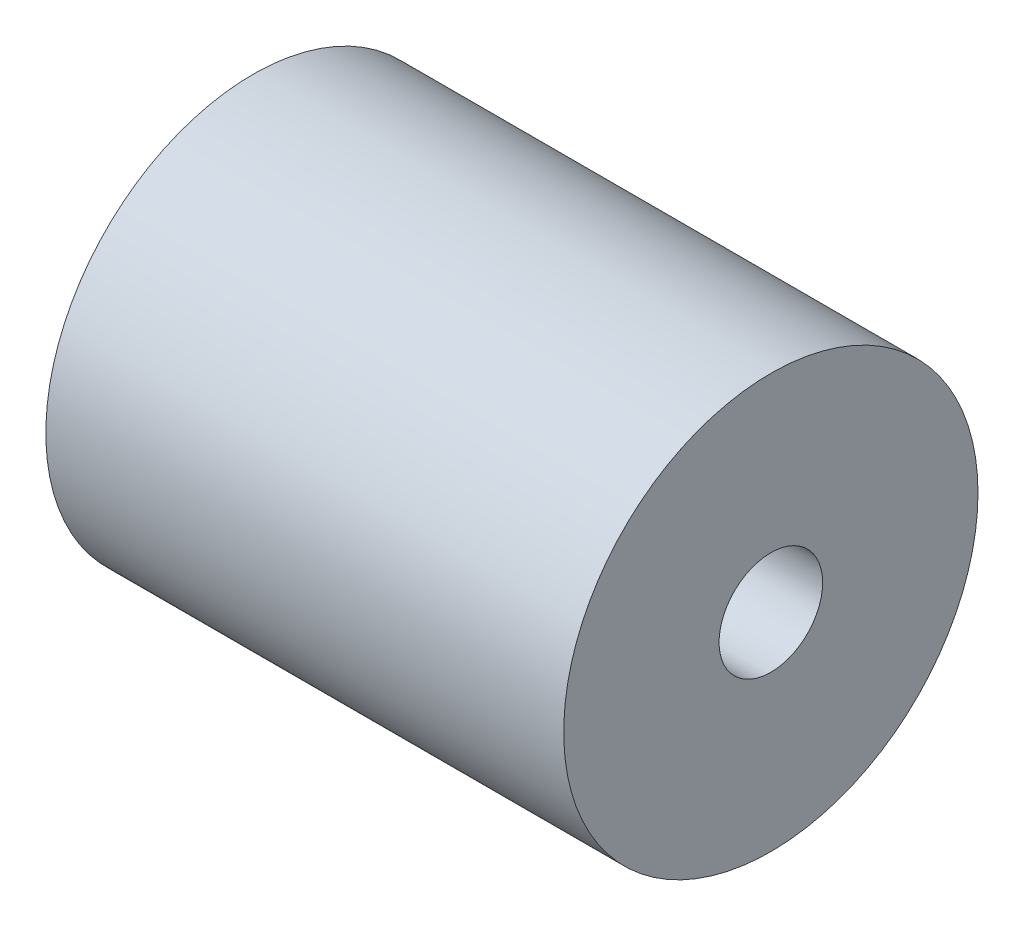
ISO-10303-21;
HEADER;
FILE_DESCRIPTION(('STEP AP214'),'2;1');
FILE_NAME('part.step','',(''),(''),'','','');
FILE_SCHEMA(('AUTOMOTIVE_DESIGN { 1 0 10303 214 1 1 1 1 }'));
ENDSEC;
DATA;
#1=APPLICATION_CONTEXT('core data for automotive mechanical design processes');
#2=APPLICATION_PROTOCOL_DEFINITION('international standard','automotive_design',2000,#1);
#3=PRODUCT_CONTEXT('',#1,'mechanical');
#4=PRODUCT('Part','Part','',(#3));
#5=PRODUCT_RELATED_PRODUCT_CATEGORY('part','',(#4));
#6=PRODUCT_DEFINITION_FORMATION('','',#4);
#7=PRODUCT_DEFINITION_CONTEXT('part definition',#1,'design');
#8=PRODUCT_DEFINITION('design','',#6,#7);
#9=PRODUCT_DEFINITION_SHAPE('','',#8);
#10=(LENGTH_UNIT() NAMED_UNIT(*) SI_UNIT(.MILLI.,.METRE.));
#11=(NAMED_UNIT(*) PLANE_ANGLE_UNIT() SI_UNIT($,.RADIAN.));
#12=(NAMED_UNIT(*) SI_UNIT($,.STERADIAN.) SOLID_ANGLE_UNIT());
#13=UNCERTAINTY_MEASURE_WITH_UNIT(LENGTH_MEASURE(1.E-05),#10,'distance_accuracy_value','');
#14=(GEOMETRIC_REPRESENTATION_CONTEXT(3) GLOBAL_UNCERTAINTY_ASSIGNED_CONTEXT((#13)) GLOBAL_UNIT_ASSIGNED_CONTEXT((#10,
#11,#12)) REPRESENTATION_CONTEXT('',''));
#15=CARTESIAN_POINT('',(0.,0.,0.));
#16=DIRECTION('',(0.,0.,1.));
#17=DIRECTION('',(1.,0.,0.));
#18=AXIS2_PLACEMENT_3D('',#15,#16,#17);
#19=CARTESIAN_POINT('',(12.5,0.,0.));
#20=DIRECTION('',(-1.,0.,0.));
#21=DIRECTION('',(0.,0.,1.));
#22=AXIS2_PLACEMENT_3D('',#19,#20,#21);
#23=CYLINDRICAL_SURFACE('',#22,10.);
#24=CARTESIAN_POINT('',(12.5,0.,0.));
#25=DIRECTION('',(1.,0.,0.));
#26=DIRECTION('',(0.,0.,-1.));
#27=AXIS2_PLACEMENT_3D('',#24,#25,#26);
#28=CIRCLE('',#27,10.);
#29=CARTESIAN_POINT('',(12.5,0.,-10.));
#30=VERTEX_POINT('',#29);
#31=EDGE_CURVE('E10',#30,#30,#28,.T.);
#32=ORIENTED_EDGE('',*,*,#31,.F.);
#33=EDGE_LOOP('',(#32));
#34=FACE_BOUND('',#33,.T.);
#35=CARTESIAN_POINT('',(-12.5,0.,0.));
#36=DIRECTION('',(1.,0.,0.));
#37=DIRECTION('',(0.,0.,-1.));
#38=AXIS2_PLACEMENT_3D('',#35,#36,#37);
#39=CIRCLE('',#38,10.);
#40=CARTESIAN_POINT('',(-12.5,0.,-10.));
#41=VERTEX_POINT('',#40);
#42=EDGE_CURVE('E37',#41,#41,#39,.T.);
#43=ORIENTED_EDGE('',*,*,#42,.T.);
#44=EDGE_LOOP('',(#43));
#45=FACE_BOUND('',#44,.T.);
#46=ADVANCED_FACE('F34',(#34,#45),#23,.T.);
#47=CARTESIAN_POINT('',(12.5,0.,0.));
#48=DIRECTION('',(1.,0.,0.));
#49=DIRECTION('',(0.,0.,-1.));
#50=AXIS2_PLACEMENT_3D('',#47,#48,#49);
#51=PLANE('',#50);
#52=CARTESIAN_POINT('',(12.5,0.,0.));
#53=DIRECTION('',(1.,0.,0.));
#54=DIRECTION('',(0.,0.,-1.));
#55=AXIS2_PLACEMENT_3D('',#52,#53,#54);
#56=CIRCLE('',#55,2.5);
#57=CARTESIAN_POINT('',(12.5,0.,-2.5));
#58=VERTEX_POINT('',#57);
#59=EDGE_CURVE('E49',#58,#58,#56,.T.);
#60=ORIENTED_EDGE('',*,*,#59,.F.);
#61=EDGE_LOOP('',(#60));
#62=FACE_BOUND('',#61,.T.);
#63=ORIENTED_EDGE('',*,*,#31,.T.);
#64=EDGE_LOOP('',(#63));
#65=FACE_BOUND('',#64,.T.);
#66=ADVANCED_FACE('F61',(#62,#65),#51,.T.);
#67=CARTESIAN_POINT('',(-12.5,0.,0.));
#68=DIRECTION('',(1.,0.,0.));
#69=DIRECTION('',(0.,0.,-1.));
#70=AXIS2_PLACEMENT_3D('',#67,#68,#69);
#71=PLANE('',#70);
#72=CARTESIAN_POINT('',(-12.5,0.,0.));
#73=DIRECTION('',(1.,0.,0.));
#74=DIRECTION('',(0.,0.,-1.));
#75=AXIS2_PLACEMENT_3D('',#72,#73,#74);
#76=CIRCLE('',#75,4.);
#77=CARTESIAN_POINT('',(-12.5,0.,-4.));
#78=VERTEX_POINT('',#77);
#79=EDGE_CURVE('E44',#78,#78,#76,.T.);
#80=ORIENTED_EDGE('',*,*,#79,.T.);
#81=EDGE_LOOP('',(#80));
#82=FACE_BOUND('',#81,.T.);
#83=ORIENTED_EDGE('',*,*,#42,.F.);
#84=EDGE_LOOP('',(#83));
#85=FACE_BOUND('',#84,.T.);
#86=ADVANCED_FACE('F63',(#82,#85),#71,.F.);
#87=CARTESIAN_POINT('',(-12.5,0.,0.));
#88=DIRECTION('',(1.,0.,0.));
#89=DIRECTION('',(0.,0.,-1.));
#90=AXIS2_PLACEMENT_3D('',#87,#88,#89);
#91=CYLINDRICAL_SURFACE('',#90,4.);
#92=ORIENTED_EDGE('',*,*,#79,.F.);
#93=EDGE_LOOP('',(#92));
#94=FACE_BOUND('',#93,.T.);
#95=CARTESIAN_POINT('',(0.,0.,0.));
#96=DIRECTION('',(1.,0.,0.));
#97=DIRECTION('',(0.,0.,-1.));
#98=AXIS2_PLACEMENT_3D('',#95,#96,#97);
#99=CIRCLE('',#98,4.);
#100=CARTESIAN_POINT('',(0.,0.,-4.));
#101=VERTEX_POINT('',#100);
#102=EDGE_CURVE('E46',#101,#101,#99,.T.);
#103=ORIENTED_EDGE('',*,*,#102,.T.);
#104=EDGE_LOOP('',(#103));
#105=FACE_BOUND('',#104,.T.);
#106=ADVANCED_FACE('F69',(#94,#105),#91,.F.);
#107=CARTESIAN_POINT('',(0.,0.,0.));
#108=DIRECTION('',(1.,0.,0.));
#109=DIRECTION('',(0.,0.,-1.));
#110=AXIS2_PLACEMENT_3D('',#107,#108,#109);
#111=PLANE('',#110);
#112=CARTESIAN_POINT('',(0.,0.,0.));
#113=DIRECTION('',(1.,0.,0.));
#114=DIRECTION('',(0.,0.,-1.));
#115=AXIS2_PLACEMENT_3D('',#112,#113,#114);
#116=CIRCLE('',#115,2.5);
#117=CARTESIAN_POINT('',(0.,0.,-2.5));
#118=VERTEX_POINT('',#117);
#119=EDGE_CURVE('E52',#118,#118,#116,.T.);
#120=ORIENTED_EDGE('',*,*,#119,.T.);
#121=EDGE_LOOP('',(#120));
#122=FACE_BOUND('',#121,.T.);
#123=ORIENTED_EDGE('',*,*,#102,.F.);
#124=EDGE_LOOP('',(#123));
#125=FACE_BOUND('',#124,.T.);
#126=ADVANCED_FACE('F75',(#122,#125),#111,.F.);
#127=CARTESIAN_POINT('',(12.5,0.,0.));
#128=DIRECTION('',(-1.,0.,0.));
#129=DIRECTION('',(0.,0.,1.));
#130=AXIS2_PLACEMENT_3D('',#127,#128,#129);
#131=CYLINDRICAL_SURFACE('',#130,2.5);
#132=ORIENTED_EDGE('',*,*,#59,.T.);
#133=EDGE_LOOP('',(#132));
#134=FACE_BOUND('',#133,.T.);
#135=ORIENTED_EDGE('',*,*,#119,.F.);
#136=EDGE_LOOP('',(#135));
#137=FACE_BOUND('',#136,.T.);
#138=ADVANCED_FACE('F58',(#134,#137),#131,.F.);
#139=CLOSED_SHELL('',(#46,#66,#86,#106,#126,#138));
#140=MANIFOLD_SOLID_BREP('B2',#139);
#141=ADVANCED_BREP_SHAPE_REPRESENTATION('',(#18,#140),#14);
#142=SHAPE_DEFINITION_REPRESENTATION(#9,#141);
ENDSEC;
END-ISO-10303-21;
